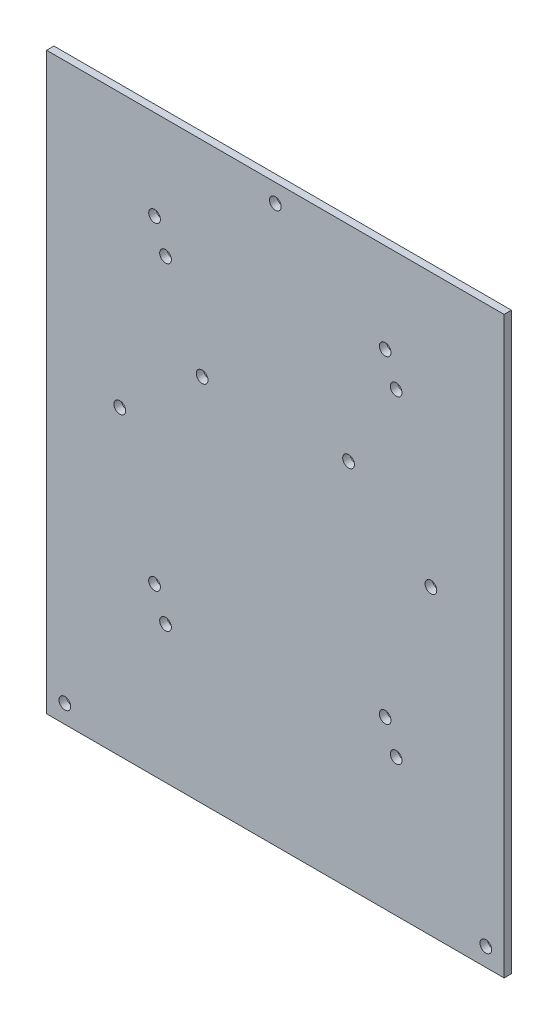
ISO-10303-21;
HEADER;
FILE_DESCRIPTION(('STEP AP214'),'2;1');
FILE_NAME('part.step','',(''),(''),'','','');
FILE_SCHEMA(('AUTOMOTIVE_DESIGN { 1 0 10303 214 1 1 1 1 }'));
ENDSEC;
DATA;
#1=APPLICATION_CONTEXT('core data for automotive mechanical design processes');
#2=APPLICATION_PROTOCOL_DEFINITION('international standard','automotive_design',2000,#1);
#3=PRODUCT_CONTEXT('',#1,'mechanical');
#4=PRODUCT('Part','Part','',(#3));
#5=PRODUCT_RELATED_PRODUCT_CATEGORY('part','',(#4));
#6=PRODUCT_DEFINITION_FORMATION('','',#4);
#7=PRODUCT_DEFINITION_CONTEXT('part definition',#1,'design');
#8=PRODUCT_DEFINITION('design','',#6,#7);
#9=PRODUCT_DEFINITION_SHAPE('','',#8);
#10=(LENGTH_UNIT() NAMED_UNIT(*) SI_UNIT(.MILLI.,.METRE.));
#11=(NAMED_UNIT(*) PLANE_ANGLE_UNIT() SI_UNIT($,.RADIAN.));
#12=(NAMED_UNIT(*) SI_UNIT($,.STERADIAN.) SOLID_ANGLE_UNIT());
#13=UNCERTAINTY_MEASURE_WITH_UNIT(LENGTH_MEASURE(1.E-05),#10,'distance_accuracy_value','');
#14=(GEOMETRIC_REPRESENTATION_CONTEXT(3) GLOBAL_UNCERTAINTY_ASSIGNED_CONTEXT((#13)) GLOBAL_UNIT_ASSIGNED_CONTEXT((#10,
#11,#12)) REPRESENTATION_CONTEXT('',''));
#15=CARTESIAN_POINT('',(0.,0.,0.));
#16=DIRECTION('',(0.,0.,1.));
#17=DIRECTION('',(1.,0.,0.));
#18=AXIS2_PLACEMENT_3D('',#15,#16,#17);
#19=CARTESIAN_POINT('',(0.,157.,2.));
#20=DIRECTION('',(0.,1.,0.));
#21=DIRECTION('',(0.,0.,1.));
#22=AXIS2_PLACEMENT_3D('',#19,#20,#21);
#23=PLANE('',#22);
#24=DIRECTION('',(1.,0.,0.));
#25=VECTOR('',#24,1.);
#26=CARTESIAN_POINT('',(0.,157.,0.));
#27=LINE('',#26,#25);
#28=CARTESIAN_POINT('',(-62.5,157.,0.));
#29=VERTEX_POINT('',#28);
#30=CARTESIAN_POINT('',(62.5,157.,0.));
#31=VERTEX_POINT('',#30);
#32=EDGE_CURVE('E147',#29,#31,#27,.T.);
#33=ORIENTED_EDGE('',*,*,#32,.F.);
#34=DIRECTION('',(0.,0.,-1.));
#35=VECTOR('',#34,1.);
#36=CARTESIAN_POINT('',(-62.5,157.,2.));
#37=LINE('',#36,#35);
#38=CARTESIAN_POINT('',(-62.5,157.,2.));
#39=VERTEX_POINT('',#38);
#40=EDGE_CURVE('E11',#39,#29,#37,.T.);
#41=ORIENTED_EDGE('',*,*,#40,.F.);
#42=DIRECTION('',(1.,0.,0.));
#43=VECTOR('',#42,1.);
#44=CARTESIAN_POINT('',(0.,157.,2.));
#45=LINE('',#44,#43);
#46=CARTESIAN_POINT('',(62.5,157.,2.));
#47=VERTEX_POINT('',#46);
#48=EDGE_CURVE('E95',#39,#47,#45,.T.);
#49=ORIENTED_EDGE('',*,*,#48,.T.);
#50=DIRECTION('',(0.,0.,-1.));
#51=VECTOR('',#50,1.);
#52=CARTESIAN_POINT('',(62.5,157.,2.));
#53=LINE('',#52,#51);
#54=EDGE_CURVE('E73',#47,#31,#53,.T.);
#55=ORIENTED_EDGE('',*,*,#54,.T.);
#56=EDGE_LOOP('',(#33,#41,#49,#55));
#57=FACE_BOUND('',#56,.T.);
#58=ADVANCED_FACE('F33',(#57),#23,.T.);
#59=CARTESIAN_POINT('',(-62.5,0.,2.));
#60=DIRECTION('',(-1.,0.,0.));
#61=DIRECTION('',(0.,0.,1.));
#62=AXIS2_PLACEMENT_3D('',#59,#60,#61);
#63=PLANE('',#62);
#64=DIRECTION('',(0.,1.,0.));
#65=VECTOR('',#64,1.);
#66=CARTESIAN_POINT('',(-62.5,0.,0.));
#67=LINE('',#66,#65);
#68=CARTESIAN_POINT('',(-62.5,0.,0.));
#69=VERTEX_POINT('',#68);
#70=EDGE_CURVE('E85',#69,#29,#67,.T.);
#71=ORIENTED_EDGE('',*,*,#70,.F.);
#72=DIRECTION('',(0.,0.,-1.));
#73=VECTOR('',#72,1.);
#74=CARTESIAN_POINT('',(-62.5,0.,2.));
#75=LINE('',#74,#73);
#76=CARTESIAN_POINT('',(-62.5,0.,2.));
#77=VERTEX_POINT('',#76);
#78=EDGE_CURVE('E42',#77,#69,#75,.T.);
#79=ORIENTED_EDGE('',*,*,#78,.F.);
#80=DIRECTION('',(0.,1.,0.));
#81=VECTOR('',#80,1.);
#82=CARTESIAN_POINT('',(-62.5,0.,2.));
#83=LINE('',#82,#81);
#84=EDGE_CURVE('E83',#77,#39,#83,.T.);
#85=ORIENTED_EDGE('',*,*,#84,.T.);
#86=ORIENTED_EDGE('',*,*,#40,.T.);
#87=EDGE_LOOP('',(#71,#79,#85,#86));
#88=FACE_BOUND('',#87,.T.);
#89=ADVANCED_FACE('F81',(#88),#63,.T.);
#90=CARTESIAN_POINT('',(0.,0.,2.));
#91=DIRECTION('',(0.,1.,0.));
#92=DIRECTION('',(-1.,0.,0.));
#93=AXIS2_PLACEMENT_3D('',#90,#91,#92);
#94=PLANE('',#93);
#95=DIRECTION('',(1.,0.,0.));
#96=VECTOR('',#95,1.);
#97=CARTESIAN_POINT('',(0.,0.,0.));
#98=LINE('',#97,#96);
#99=CARTESIAN_POINT('',(62.5,0.,0.));
#100=VERTEX_POINT('',#99);
#101=EDGE_CURVE('E150',#69,#100,#98,.T.);
#102=ORIENTED_EDGE('',*,*,#101,.T.);
#103=DIRECTION('',(0.,0.,-1.));
#104=VECTOR('',#103,1.);
#105=CARTESIAN_POINT('',(62.5,0.,2.));
#106=LINE('',#105,#104);
#107=CARTESIAN_POINT('',(62.5,0.,2.));
#108=VERTEX_POINT('',#107);
#109=EDGE_CURVE('E88',#108,#100,#106,.T.);
#110=ORIENTED_EDGE('',*,*,#109,.F.);
#111=DIRECTION('',(1.,0.,0.));
#112=VECTOR('',#111,1.);
#113=CARTESIAN_POINT('',(0.,0.,2.));
#114=LINE('',#113,#112);
#115=EDGE_CURVE('E90',#77,#108,#114,.T.);
#116=ORIENTED_EDGE('',*,*,#115,.F.);
#117=ORIENTED_EDGE('',*,*,#78,.T.);
#118=EDGE_LOOP('',(#102,#110,#116,#117));
#119=FACE_BOUND('',#118,.T.);
#120=ADVANCED_FACE('F91',(#119),#94,.F.);
#121=CARTESIAN_POINT('',(-30.,124.5,2.));
#122=DIRECTION('',(0.,0.,-1.));
#123=DIRECTION('',(-1.,0.,0.));
#124=AXIS2_PLACEMENT_3D('',#121,#122,#123);
#125=CYLINDRICAL_SURFACE('',#124,1.6);
#126=CARTESIAN_POINT('',(-30.,124.5,2.));
#127=DIRECTION('',(0.,0.,1.));
#128=DIRECTION('',(1.,0.,0.));
#129=AXIS2_PLACEMENT_3D('',#126,#127,#128);
#130=CIRCLE('',#129,1.6);
#131=CARTESIAN_POINT('',(-28.4,124.5,2.));
#132=VERTEX_POINT('',#131);
#133=EDGE_CURVE('E135',#132,#132,#130,.T.);
#134=ORIENTED_EDGE('',*,*,#133,.T.);
#135=EDGE_LOOP('',(#134));
#136=FACE_BOUND('',#135,.T.);
#137=CARTESIAN_POINT('',(-30.,124.5,0.));
#138=DIRECTION('',(0.,0.,1.));
#139=DIRECTION('',(1.,0.,0.));
#140=AXIS2_PLACEMENT_3D('',#137,#138,#139);
#141=CIRCLE('',#140,1.6);
#142=CARTESIAN_POINT('',(-28.4,124.5,0.));
#143=VERTEX_POINT('',#142);
#144=EDGE_CURVE('E186',#143,#143,#141,.T.);
#145=ORIENTED_EDGE('',*,*,#144,.F.);
#146=EDGE_LOOP('',(#145));
#147=FACE_BOUND('',#146,.T.);
#148=ADVANCED_FACE('F234',(#136,#147),#125,.F.);
#149=CARTESIAN_POINT('',(30.,45.5,2.));
#150=DIRECTION('',(0.,0.,-1.));
#151=DIRECTION('',(-1.,0.,0.));
#152=AXIS2_PLACEMENT_3D('',#149,#150,#151);
#153=CYLINDRICAL_SURFACE('',#152,1.6);
#154=CARTESIAN_POINT('',(30.,45.5,2.));
#155=DIRECTION('',(0.,0.,1.));
#156=DIRECTION('',(1.,0.,0.));
#157=AXIS2_PLACEMENT_3D('',#154,#155,#156);
#158=CIRCLE('',#157,1.6);
#159=CARTESIAN_POINT('',(31.6,45.5,2.));
#160=VERTEX_POINT('',#159);
#161=EDGE_CURVE('E132',#160,#160,#158,.T.);
#162=ORIENTED_EDGE('',*,*,#161,.T.);
#163=EDGE_LOOP('',(#162));
#164=FACE_BOUND('',#163,.T.);
#165=CARTESIAN_POINT('',(30.,45.5,0.));
#166=DIRECTION('',(0.,0.,1.));
#167=DIRECTION('',(1.,0.,0.));
#168=AXIS2_PLACEMENT_3D('',#165,#166,#167);
#169=CIRCLE('',#168,1.6);
#170=CARTESIAN_POINT('',(31.6,45.5,0.));
#171=VERTEX_POINT('',#170);
#172=EDGE_CURVE('E183',#171,#171,#169,.T.);
#173=ORIENTED_EDGE('',*,*,#172,.F.);
#174=EDGE_LOOP('',(#173));
#175=FACE_BOUND('',#174,.T.);
#176=ADVANCED_FACE('F237',(#164,#175),#153,.F.);
#177=CARTESIAN_POINT('',(33.,37.5,2.));
#178=DIRECTION('',(0.,0.,-1.));
#179=DIRECTION('',(-1.,0.,0.));
#180=AXIS2_PLACEMENT_3D('',#177,#178,#179);
#181=CYLINDRICAL_SURFACE('',#180,1.6);
#182=CARTESIAN_POINT('',(33.,37.5,2.));
#183=DIRECTION('',(0.,0.,1.));
#184=DIRECTION('',(1.,0.,0.));
#185=AXIS2_PLACEMENT_3D('',#182,#183,#184);
#186=CIRCLE('',#185,1.6);
#187=CARTESIAN_POINT('',(34.6,37.5,2.));
#188=VERTEX_POINT('',#187);
#189=EDGE_CURVE('E129',#188,#188,#186,.T.);
#190=ORIENTED_EDGE('',*,*,#189,.T.);
#191=EDGE_LOOP('',(#190));
#192=FACE_BOUND('',#191,.T.);
#193=CARTESIAN_POINT('',(33.,37.5,0.));
#194=DIRECTION('',(0.,0.,1.));
#195=DIRECTION('',(1.,0.,0.));
#196=AXIS2_PLACEMENT_3D('',#193,#194,#195);
#197=CIRCLE('',#196,1.6);
#198=CARTESIAN_POINT('',(34.6,37.5,0.));
#199=VERTEX_POINT('',#198);
#200=EDGE_CURVE('E180',#199,#199,#197,.T.);
#201=ORIENTED_EDGE('',*,*,#200,.F.);
#202=EDGE_LOOP('',(#201));
#203=FACE_BOUND('',#202,.T.);
#204=ADVANCED_FACE('F241',(#192,#203),#181,.F.);
#205=CARTESIAN_POINT('',(-33.,45.5,2.));
#206=DIRECTION('',(0.,0.,-1.));
#207=DIRECTION('',(-1.,0.,0.));
#208=AXIS2_PLACEMENT_3D('',#205,#206,#207);
#209=CYLINDRICAL_SURFACE('',#208,1.6);
#210=CARTESIAN_POINT('',(-33.,45.5,2.));
#211=DIRECTION('',(0.,0.,1.));
#212=DIRECTION('',(1.,0.,0.));
#213=AXIS2_PLACEMENT_3D('',#210,#211,#212);
#214=CIRCLE('',#213,1.6);
#215=CARTESIAN_POINT('',(-31.4,45.5,2.));
#216=VERTEX_POINT('',#215);
#217=EDGE_CURVE('E126',#216,#216,#214,.T.);
#218=ORIENTED_EDGE('',*,*,#217,.T.);
#219=EDGE_LOOP('',(#218));
#220=FACE_BOUND('',#219,.T.);
#221=CARTESIAN_POINT('',(-33.,45.5,0.));
#222=DIRECTION('',(0.,0.,1.));
#223=DIRECTION('',(1.,0.,0.));
#224=AXIS2_PLACEMENT_3D('',#221,#222,#223);
#225=CIRCLE('',#224,1.6);
#226=CARTESIAN_POINT('',(-31.4,45.5,0.));
#227=VERTEX_POINT('',#226);
#228=EDGE_CURVE('E177',#227,#227,#225,.T.);
#229=ORIENTED_EDGE('',*,*,#228,.F.);
#230=EDGE_LOOP('',(#229));
#231=FACE_BOUND('',#230,.T.);
#232=ADVANCED_FACE('F245',(#220,#231),#209,.F.);
#233=CARTESIAN_POINT('',(-30.,37.5,2.));
#234=DIRECTION('',(0.,0.,-1.));
#235=DIRECTION('',(-1.,0.,0.));
#236=AXIS2_PLACEMENT_3D('',#233,#234,#235);
#237=CYLINDRICAL_SURFACE('',#236,1.6);
#238=CARTESIAN_POINT('',(-30.,37.5,2.));
#239=DIRECTION('',(0.,0.,1.));
#240=DIRECTION('',(1.,0.,0.));
#241=AXIS2_PLACEMENT_3D('',#238,#239,#240);
#242=CIRCLE('',#241,1.6);
#243=CARTESIAN_POINT('',(-28.4,37.5,2.));
#244=VERTEX_POINT('',#243);
#245=EDGE_CURVE('E123',#244,#244,#242,.T.);
#246=ORIENTED_EDGE('',*,*,#245,.T.);
#247=EDGE_LOOP('',(#246));
#248=FACE_BOUND('',#247,.T.);
#249=CARTESIAN_POINT('',(-30.,37.5,0.));
#250=DIRECTION('',(0.,0.,1.));
#251=DIRECTION('',(1.,0.,0.));
#252=AXIS2_PLACEMENT_3D('',#249,#250,#251);
#253=CIRCLE('',#252,1.6);
#254=CARTESIAN_POINT('',(-28.4,37.5,0.));
#255=VERTEX_POINT('',#254);
#256=EDGE_CURVE('E174',#255,#255,#253,.T.);
#257=ORIENTED_EDGE('',*,*,#256,.F.);
#258=EDGE_LOOP('',(#257));
#259=FACE_BOUND('',#258,.T.);
#260=ADVANCED_FACE('F249',(#248,#259),#237,.F.);
#261=CARTESIAN_POINT('',(33.,124.5,2.));
#262=DIRECTION('',(0.,0.,-1.));
#263=DIRECTION('',(-1.,0.,0.));
#264=AXIS2_PLACEMENT_3D('',#261,#262,#263);
#265=CYLINDRICAL_SURFACE('',#264,1.6);
#266=CARTESIAN_POINT('',(33.,124.5,2.));
#267=DIRECTION('',(0.,0.,1.));
#268=DIRECTION('',(1.,0.,0.));
#269=AXIS2_PLACEMENT_3D('',#266,#267,#268);
#270=CIRCLE('',#269,1.6);
#271=CARTESIAN_POINT('',(34.6,124.5,2.));
#272=VERTEX_POINT('',#271);
#273=EDGE_CURVE('E120',#272,#272,#270,.T.);
#274=ORIENTED_EDGE('',*,*,#273,.T.);
#275=EDGE_LOOP('',(#274));
#276=FACE_BOUND('',#275,.T.);
#277=CARTESIAN_POINT('',(33.,124.5,0.));
#278=DIRECTION('',(0.,0.,1.));
#279=DIRECTION('',(1.,0.,0.));
#280=AXIS2_PLACEMENT_3D('',#277,#278,#279);
#281=CIRCLE('',#280,1.6);
#282=CARTESIAN_POINT('',(34.6,124.5,0.));
#283=VERTEX_POINT('',#282);
#284=EDGE_CURVE('E171',#283,#283,#281,.T.);
#285=ORIENTED_EDGE('',*,*,#284,.F.);
#286=EDGE_LOOP('',(#285));
#287=FACE_BOUND('',#286,.T.);
#288=ADVANCED_FACE('F253',(#276,#287),#265,.F.);
#289=CARTESIAN_POINT('',(30.,132.5,2.));
#290=DIRECTION('',(0.,0.,-1.));
#291=DIRECTION('',(-1.,0.,0.));
#292=AXIS2_PLACEMENT_3D('',#289,#290,#291);
#293=CYLINDRICAL_SURFACE('',#292,1.6);
#294=CARTESIAN_POINT('',(30.,132.5,2.));
#295=DIRECTION('',(0.,0.,1.));
#296=DIRECTION('',(1.,0.,0.));
#297=AXIS2_PLACEMENT_3D('',#294,#295,#296);
#298=CIRCLE('',#297,1.6);
#299=CARTESIAN_POINT('',(31.6000000000001,132.5,2.));
#300=VERTEX_POINT('',#299);
#301=EDGE_CURVE('E117',#300,#300,#298,.T.);
#302=ORIENTED_EDGE('',*,*,#301,.T.);
#303=EDGE_LOOP('',(#302));
#304=FACE_BOUND('',#303,.T.);
#305=CARTESIAN_POINT('',(30.,132.5,0.));
#306=DIRECTION('',(0.,0.,1.));
#307=DIRECTION('',(1.,0.,0.));
#308=AXIS2_PLACEMENT_3D('',#305,#306,#307);
#309=CIRCLE('',#308,1.6);
#310=CARTESIAN_POINT('',(31.6000000000001,132.5,0.));
#311=VERTEX_POINT('',#310);
#312=EDGE_CURVE('E168',#311,#311,#309,.T.);
#313=ORIENTED_EDGE('',*,*,#312,.F.);
#314=EDGE_LOOP('',(#313));
#315=FACE_BOUND('',#314,.T.);
#316=ADVANCED_FACE('F257',(#304,#315),#293,.F.);
#317=CARTESIAN_POINT('',(-57.5,5.,2.));
#318=DIRECTION('',(0.,0.,-1.));
#319=DIRECTION('',(-1.,0.,0.));
#320=AXIS2_PLACEMENT_3D('',#317,#318,#319);
#321=CYLINDRICAL_SURFACE('',#320,1.6);
#322=CARTESIAN_POINT('',(-57.5,5.,2.));
#323=DIRECTION('',(0.,0.,1.));
#324=DIRECTION('',(1.,0.,0.));
#325=AXIS2_PLACEMENT_3D('',#322,#323,#324);
#326=CIRCLE('',#325,1.6);
#327=CARTESIAN_POINT('',(-55.9,5.,2.));
#328=VERTEX_POINT('',#327);
#329=EDGE_CURVE('E114',#328,#328,#326,.F.);
#330=ORIENTED_EDGE('',*,*,#329,.F.);
#331=EDGE_LOOP('',(#330));
#332=FACE_BOUND('',#331,.T.);
#333=CARTESIAN_POINT('',(-57.5,5.,0.));
#334=DIRECTION('',(0.,0.,1.));
#335=DIRECTION('',(1.,0.,0.));
#336=AXIS2_PLACEMENT_3D('',#333,#334,#335);
#337=CIRCLE('',#336,1.6);
#338=CARTESIAN_POINT('',(-55.9,5.,0.));
#339=VERTEX_POINT('',#338);
#340=EDGE_CURVE('E165',#339,#339,#337,.F.);
#341=ORIENTED_EDGE('',*,*,#340,.T.);
#342=EDGE_LOOP('',(#341));
#343=FACE_BOUND('',#342,.T.);
#344=ADVANCED_FACE('F261',(#332,#343),#321,.F.);
#345=CARTESIAN_POINT('',(57.5,5.,2.));
#346=DIRECTION('',(0.,0.,-1.));
#347=DIRECTION('',(-1.,0.,0.));
#348=AXIS2_PLACEMENT_3D('',#345,#346,#347);
#349=CYLINDRICAL_SURFACE('',#348,1.6);
#350=CARTESIAN_POINT('',(57.5,5.,2.));
#351=DIRECTION('',(0.,0.,1.));
#352=DIRECTION('',(1.,0.,0.));
#353=AXIS2_PLACEMENT_3D('',#350,#351,#352);
#354=CIRCLE('',#353,1.6);
#355=CARTESIAN_POINT('',(59.1,5.,2.));
#356=VERTEX_POINT('',#355);
#357=EDGE_CURVE('E111',#356,#356,#354,.T.);
#358=ORIENTED_EDGE('',*,*,#357,.T.);
#359=EDGE_LOOP('',(#358));
#360=FACE_BOUND('',#359,.T.);
#361=CARTESIAN_POINT('',(57.5,5.,0.));
#362=DIRECTION('',(0.,0.,1.));
#363=DIRECTION('',(1.,0.,0.));
#364=AXIS2_PLACEMENT_3D('',#361,#362,#363);
#365=CIRCLE('',#364,1.6);
#366=CARTESIAN_POINT('',(59.1,5.,0.));
#367=VERTEX_POINT('',#366);
#368=EDGE_CURVE('E162',#367,#367,#365,.T.);
#369=ORIENTED_EDGE('',*,*,#368,.F.);
#370=EDGE_LOOP('',(#369));
#371=FACE_BOUND('',#370,.T.);
#372=ADVANCED_FACE('F265',(#360,#371),#349,.F.);
#373=CARTESIAN_POINT('',(-20.,101.,2.));
#374=DIRECTION('',(0.,0.,-1.));
#375=DIRECTION('',(-1.,0.,0.));
#376=AXIS2_PLACEMENT_3D('',#373,#374,#375);
#377=CYLINDRICAL_SURFACE('',#376,1.6);
#378=CARTESIAN_POINT('',(-20.,101.,2.));
#379=DIRECTION('',(0.,0.,1.));
#380=DIRECTION('',(1.,0.,0.));
#381=AXIS2_PLACEMENT_3D('',#378,#379,#380);
#382=CIRCLE('',#381,1.6);
#383=CARTESIAN_POINT('',(-18.4,101.,2.));
#384=VERTEX_POINT('',#383);
#385=EDGE_CURVE('E108',#384,#384,#382,.F.);
#386=ORIENTED_EDGE('',*,*,#385,.F.);
#387=EDGE_LOOP('',(#386));
#388=FACE_BOUND('',#387,.T.);
#389=CARTESIAN_POINT('',(-20.,101.,0.));
#390=DIRECTION('',(0.,0.,1.));
#391=DIRECTION('',(1.,0.,0.));
#392=AXIS2_PLACEMENT_3D('',#389,#390,#391);
#393=CIRCLE('',#392,1.6);
#394=CARTESIAN_POINT('',(-18.4,101.,0.));
#395=VERTEX_POINT('',#394);
#396=EDGE_CURVE('E159',#395,#395,#393,.F.);
#397=ORIENTED_EDGE('',*,*,#396,.T.);
#398=EDGE_LOOP('',(#397));
#399=FACE_BOUND('',#398,.T.);
#400=ADVANCED_FACE('F269',(#388,#399),#377,.F.);
#401=CARTESIAN_POINT('',(20.,101.,2.));
#402=DIRECTION('',(0.,0.,-1.));
#403=DIRECTION('',(-1.,0.,0.));
#404=AXIS2_PLACEMENT_3D('',#401,#402,#403);
#405=CYLINDRICAL_SURFACE('',#404,1.6);
#406=CARTESIAN_POINT('',(20.,101.,2.));
#407=DIRECTION('',(0.,0.,1.));
#408=DIRECTION('',(1.,0.,0.));
#409=AXIS2_PLACEMENT_3D('',#406,#407,#408);
#410=CIRCLE('',#409,1.6);
#411=CARTESIAN_POINT('',(21.6,101.,2.));
#412=VERTEX_POINT('',#411);
#413=EDGE_CURVE('E105',#412,#412,#410,.T.);
#414=ORIENTED_EDGE('',*,*,#413,.T.);
#415=EDGE_LOOP('',(#414));
#416=FACE_BOUND('',#415,.T.);
#417=CARTESIAN_POINT('',(20.,101.,0.));
#418=DIRECTION('',(0.,0.,1.));
#419=DIRECTION('',(1.,0.,0.));
#420=AXIS2_PLACEMENT_3D('',#417,#418,#419);
#421=CIRCLE('',#420,1.6);
#422=CARTESIAN_POINT('',(21.6,101.,0.));
#423=VERTEX_POINT('',#422);
#424=EDGE_CURVE('E156',#423,#423,#421,.T.);
#425=ORIENTED_EDGE('',*,*,#424,.F.);
#426=EDGE_LOOP('',(#425));
#427=FACE_BOUND('',#426,.T.);
#428=ADVANCED_FACE('F273',(#416,#427),#405,.F.);
#429=CARTESIAN_POINT('',(0.,152.,2.));
#430=DIRECTION('',(0.,0.,-1.));
#431=DIRECTION('',(-1.,0.,0.));
#432=AXIS2_PLACEMENT_3D('',#429,#430,#431);
#433=CYLINDRICAL_SURFACE('',#432,1.6);
#434=CARTESIAN_POINT('',(0.,152.,2.));
#435=DIRECTION('',(0.,0.,1.));
#436=DIRECTION('',(1.,0.,0.));
#437=AXIS2_PLACEMENT_3D('',#434,#435,#436);
#438=CIRCLE('',#437,1.6);
#439=CARTESIAN_POINT('',(1.6,152.,2.));
#440=VERTEX_POINT('',#439);
#441=EDGE_CURVE('E102',#440,#440,#438,.T.);
#442=ORIENTED_EDGE('',*,*,#441,.T.);
#443=EDGE_LOOP('',(#442));
#444=FACE_BOUND('',#443,.T.);
#445=CARTESIAN_POINT('',(0.,152.,0.));
#446=DIRECTION('',(0.,0.,1.));
#447=DIRECTION('',(1.,0.,0.));
#448=AXIS2_PLACEMENT_3D('',#445,#446,#447);
#449=CIRCLE('',#448,1.6);
#450=CARTESIAN_POINT('',(1.6,152.,0.));
#451=VERTEX_POINT('',#450);
#452=EDGE_CURVE('E153',#451,#451,#449,.T.);
#453=ORIENTED_EDGE('',*,*,#452,.F.);
#454=EDGE_LOOP('',(#453));
#455=FACE_BOUND('',#454,.T.);
#456=ADVANCED_FACE('F214',(#444,#455),#433,.F.);
#457=CARTESIAN_POINT('',(62.5,0.,2.));
#458=DIRECTION('',(-1.,0.,0.));
#459=DIRECTION('',(0.,0.,1.));
#460=AXIS2_PLACEMENT_3D('',#457,#458,#459);
#461=PLANE('',#460);
#462=DIRECTION('',(0.,1.,0.));
#463=VECTOR('',#462,1.);
#464=CARTESIAN_POINT('',(62.5,0.,0.));
#465=LINE('',#464,#463);
#466=EDGE_CURVE('E66',#100,#31,#465,.T.);
#467=ORIENTED_EDGE('',*,*,#466,.T.);
#468=ORIENTED_EDGE('',*,*,#54,.F.);
#469=DIRECTION('',(0.,1.,0.));
#470=VECTOR('',#469,1.);
#471=CARTESIAN_POINT('',(62.5,0.,2.));
#472=LINE('',#471,#470);
#473=EDGE_CURVE('E50',#108,#47,#472,.T.);
#474=ORIENTED_EDGE('',*,*,#473,.F.);
#475=ORIENTED_EDGE('',*,*,#109,.T.);
#476=EDGE_LOOP('',(#467,#468,#474,#475));
#477=FACE_BOUND('',#476,.T.);
#478=ADVANCED_FACE('F195',(#477),#461,.F.);
#479=CARTESIAN_POINT('',(42.5,82.5,2.));
#480=DIRECTION('',(0.,0.,-1.));
#481=DIRECTION('',(-1.,0.,0.));
#482=AXIS2_PLACEMENT_3D('',#479,#480,#481);
#483=CYLINDRICAL_SURFACE('',#482,1.6);
#484=CARTESIAN_POINT('',(42.5,82.5,2.));
#485=DIRECTION('',(0.,0.,1.));
#486=DIRECTION('',(1.,0.,0.));
#487=AXIS2_PLACEMENT_3D('',#484,#485,#486);
#488=CIRCLE('',#487,1.6);
#489=CARTESIAN_POINT('',(44.1,82.5,2.));
#490=VERTEX_POINT('',#489);
#491=EDGE_CURVE('E97',#490,#490,#488,.T.);
#492=ORIENTED_EDGE('',*,*,#491,.T.);
#493=EDGE_LOOP('',(#492));
#494=FACE_BOUND('',#493,.T.);
#495=CARTESIAN_POINT('',(42.5,82.5,0.));
#496=DIRECTION('',(0.,0.,1.));
#497=DIRECTION('',(1.,0.,0.));
#498=AXIS2_PLACEMENT_3D('',#495,#496,#497);
#499=CIRCLE('',#498,1.6);
#500=CARTESIAN_POINT('',(44.1,82.5,0.));
#501=VERTEX_POINT('',#500);
#502=EDGE_CURVE('E144',#501,#501,#499,.T.);
#503=ORIENTED_EDGE('',*,*,#502,.F.);
#504=EDGE_LOOP('',(#503));
#505=FACE_BOUND('',#504,.T.);
#506=ADVANCED_FACE('F205',(#494,#505),#483,.F.);
#507=CARTESIAN_POINT('',(-42.5,82.5,2.));
#508=DIRECTION('',(0.,0.,-1.));
#509=DIRECTION('',(-1.,0.,0.));
#510=AXIS2_PLACEMENT_3D('',#507,#508,#509);
#511=CYLINDRICAL_SURFACE('',#510,1.6);
#512=CARTESIAN_POINT('',(-42.5,82.5,2.));
#513=DIRECTION('',(0.,0.,1.));
#514=DIRECTION('',(1.,0.,0.));
#515=AXIS2_PLACEMENT_3D('',#512,#513,#514);
#516=CIRCLE('',#515,1.6);
#517=CARTESIAN_POINT('',(-40.9,82.5,2.));
#518=VERTEX_POINT('',#517);
#519=EDGE_CURVE('E192',#518,#518,#516,.F.);
#520=ORIENTED_EDGE('',*,*,#519,.F.);
#521=EDGE_LOOP('',(#520));
#522=FACE_BOUND('',#521,.T.);
#523=CARTESIAN_POINT('',(-42.5,82.5,0.));
#524=DIRECTION('',(0.,0.,1.));
#525=DIRECTION('',(1.,0.,0.));
#526=AXIS2_PLACEMENT_3D('',#523,#524,#525);
#527=CIRCLE('',#526,1.6);
#528=CARTESIAN_POINT('',(-40.9,82.5,0.));
#529=VERTEX_POINT('',#528);
#530=EDGE_CURVE('E141',#529,#529,#527,.F.);
#531=ORIENTED_EDGE('',*,*,#530,.T.);
#532=EDGE_LOOP('',(#531));
#533=FACE_BOUND('',#532,.T.);
#534=ADVANCED_FACE('F35',(#522,#533),#511,.F.);
#535=CARTESIAN_POINT('',(-33.,132.5,2.));
#536=DIRECTION('',(0.,0.,-1.));
#537=DIRECTION('',(-1.,0.,0.));
#538=AXIS2_PLACEMENT_3D('',#535,#536,#537);
#539=CYLINDRICAL_SURFACE('',#538,1.6);
#540=CARTESIAN_POINT('',(-33.,132.5,2.));
#541=DIRECTION('',(0.,0.,1.));
#542=DIRECTION('',(1.,0.,0.));
#543=AXIS2_PLACEMENT_3D('',#540,#541,#542);
#544=CIRCLE('',#543,1.6);
#545=CARTESIAN_POINT('',(-31.4,132.5,2.));
#546=VERTEX_POINT('',#545);
#547=EDGE_CURVE('E138',#546,#546,#544,.T.);
#548=ORIENTED_EDGE('',*,*,#547,.T.);
#549=EDGE_LOOP('',(#548));
#550=FACE_BOUND('',#549,.T.);
#551=CARTESIAN_POINT('',(-33.,132.5,0.));
#552=DIRECTION('',(0.,0.,1.));
#553=DIRECTION('',(1.,0.,0.));
#554=AXIS2_PLACEMENT_3D('',#551,#552,#553);
#555=CIRCLE('',#554,1.6);
#556=CARTESIAN_POINT('',(-31.4,132.5,0.));
#557=VERTEX_POINT('',#556);
#558=EDGE_CURVE('E189',#557,#557,#555,.T.);
#559=ORIENTED_EDGE('',*,*,#558,.F.);
#560=EDGE_LOOP('',(#559));
#561=FACE_BOUND('',#560,.T.);
#562=ADVANCED_FACE('F212',(#550,#561),#539,.F.);
#563=CARTESIAN_POINT('',(0.,0.,2.));
#564=DIRECTION('',(0.,0.,1.));
#565=DIRECTION('',(1.,0.,0.));
#566=AXIS2_PLACEMENT_3D('',#563,#564,#565);
#567=PLANE('',#566);
#568=ORIENTED_EDGE('',*,*,#519,.T.);
#569=EDGE_LOOP('',(#568));
#570=FACE_BOUND('',#569,.T.);
#571=ORIENTED_EDGE('',*,*,#491,.F.);
#572=EDGE_LOOP('',(#571));
#573=FACE_BOUND('',#572,.T.);
#574=ORIENTED_EDGE('',*,*,#48,.F.);
#575=ORIENTED_EDGE('',*,*,#84,.F.);
#576=ORIENTED_EDGE('',*,*,#115,.T.);
#577=ORIENTED_EDGE('',*,*,#473,.T.);
#578=EDGE_LOOP('',(#574,#575,#576,#577));
#579=FACE_BOUND('',#578,.T.);
#580=ORIENTED_EDGE('',*,*,#441,.F.);
#581=EDGE_LOOP('',(#580));
#582=FACE_BOUND('',#581,.T.);
#583=ORIENTED_EDGE('',*,*,#413,.F.);
#584=EDGE_LOOP('',(#583));
#585=FACE_BOUND('',#584,.T.);
#586=ORIENTED_EDGE('',*,*,#385,.T.);
#587=EDGE_LOOP('',(#586));
#588=FACE_BOUND('',#587,.T.);
#589=ORIENTED_EDGE('',*,*,#357,.F.);
#590=EDGE_LOOP('',(#589));
#591=FACE_BOUND('',#590,.T.);
#592=ORIENTED_EDGE('',*,*,#329,.T.);
#593=EDGE_LOOP('',(#592));
#594=FACE_BOUND('',#593,.T.);
#595=ORIENTED_EDGE('',*,*,#301,.F.);
#596=EDGE_LOOP('',(#595));
#597=FACE_BOUND('',#596,.T.);
#598=ORIENTED_EDGE('',*,*,#273,.F.);
#599=EDGE_LOOP('',(#598));
#600=FACE_BOUND('',#599,.T.);
#601=ORIENTED_EDGE('',*,*,#245,.F.);
#602=EDGE_LOOP('',(#601));
#603=FACE_BOUND('',#602,.T.);
#604=ORIENTED_EDGE('',*,*,#217,.F.);
#605=EDGE_LOOP('',(#604));
#606=FACE_BOUND('',#605,.T.);
#607=ORIENTED_EDGE('',*,*,#189,.F.);
#608=EDGE_LOOP('',(#607));
#609=FACE_BOUND('',#608,.T.);
#610=ORIENTED_EDGE('',*,*,#161,.F.);
#611=EDGE_LOOP('',(#610));
#612=FACE_BOUND('',#611,.T.);
#613=ORIENTED_EDGE('',*,*,#133,.F.);
#614=EDGE_LOOP('',(#613));
#615=FACE_BOUND('',#614,.T.);
#616=ORIENTED_EDGE('',*,*,#547,.F.);
#617=EDGE_LOOP('',(#616));
#618=FACE_BOUND('',#617,.T.);
#619=ADVANCED_FACE('F93',(#570,#573,#579,#582,#585,#588,#591,#594,#597,#600,#603,#606,#609,#612,
#615,#618),#567,.T.);
#620=CARTESIAN_POINT('',(0.,0.,0.));
#621=DIRECTION('',(0.,0.,1.));
#622=DIRECTION('',(1.,0.,0.));
#623=AXIS2_PLACEMENT_3D('',#620,#621,#622);
#624=PLANE('',#623);
#625=ORIENTED_EDGE('',*,*,#530,.F.);
#626=EDGE_LOOP('',(#625));
#627=FACE_BOUND('',#626,.T.);
#628=ORIENTED_EDGE('',*,*,#502,.T.);
#629=EDGE_LOOP('',(#628));
#630=FACE_BOUND('',#629,.T.);
#631=ORIENTED_EDGE('',*,*,#32,.T.);
#632=ORIENTED_EDGE('',*,*,#466,.F.);
#633=ORIENTED_EDGE('',*,*,#101,.F.);
#634=ORIENTED_EDGE('',*,*,#70,.T.);
#635=EDGE_LOOP('',(#631,#632,#633,#634));
#636=FACE_BOUND('',#635,.T.);
#637=ORIENTED_EDGE('',*,*,#452,.T.);
#638=EDGE_LOOP('',(#637));
#639=FACE_BOUND('',#638,.T.);
#640=ORIENTED_EDGE('',*,*,#424,.T.);
#641=EDGE_LOOP('',(#640));
#642=FACE_BOUND('',#641,.T.);
#643=ORIENTED_EDGE('',*,*,#396,.F.);
#644=EDGE_LOOP('',(#643));
#645=FACE_BOUND('',#644,.T.);
#646=ORIENTED_EDGE('',*,*,#368,.T.);
#647=EDGE_LOOP('',(#646));
#648=FACE_BOUND('',#647,.T.);
#649=ORIENTED_EDGE('',*,*,#340,.F.);
#650=EDGE_LOOP('',(#649));
#651=FACE_BOUND('',#650,.T.);
#652=ORIENTED_EDGE('',*,*,#312,.T.);
#653=EDGE_LOOP('',(#652));
#654=FACE_BOUND('',#653,.T.);
#655=ORIENTED_EDGE('',*,*,#284,.T.);
#656=EDGE_LOOP('',(#655));
#657=FACE_BOUND('',#656,.T.);
#658=ORIENTED_EDGE('',*,*,#256,.T.);
#659=EDGE_LOOP('',(#658));
#660=FACE_BOUND('',#659,.T.);
#661=ORIENTED_EDGE('',*,*,#228,.T.);
#662=EDGE_LOOP('',(#661));
#663=FACE_BOUND('',#662,.T.);
#664=ORIENTED_EDGE('',*,*,#200,.T.);
#665=EDGE_LOOP('',(#664));
#666=FACE_BOUND('',#665,.T.);
#667=ORIENTED_EDGE('',*,*,#172,.T.);
#668=EDGE_LOOP('',(#667));
#669=FACE_BOUND('',#668,.T.);
#670=ORIENTED_EDGE('',*,*,#144,.T.);
#671=EDGE_LOOP('',(#670));
#672=FACE_BOUND('',#671,.T.);
#673=ORIENTED_EDGE('',*,*,#558,.T.);
#674=EDGE_LOOP('',(#673));
#675=FACE_BOUND('',#674,.T.);
#676=ADVANCED_FACE('F196',(#627,#630,#636,#639,#642,#645,#648,#651,#654,#657,#660,#663,#666,
#669,#672,#675),#624,.F.);
#677=CLOSED_SHELL('',(#58,#89,#120,#148,#176,#204,#232,#260,#288,#316,#344,#372,#400,#428,#456,
#478,#506,#534,#562,#619,#676));
#678=MANIFOLD_SOLID_BREP('B2',#677);
#679=ADVANCED_BREP_SHAPE_REPRESENTATION('',(#18,#678),#14);
#680=SHAPE_DEFINITION_REPRESENTATION(#9,#679);
ENDSEC;
END-ISO-10303-21;
